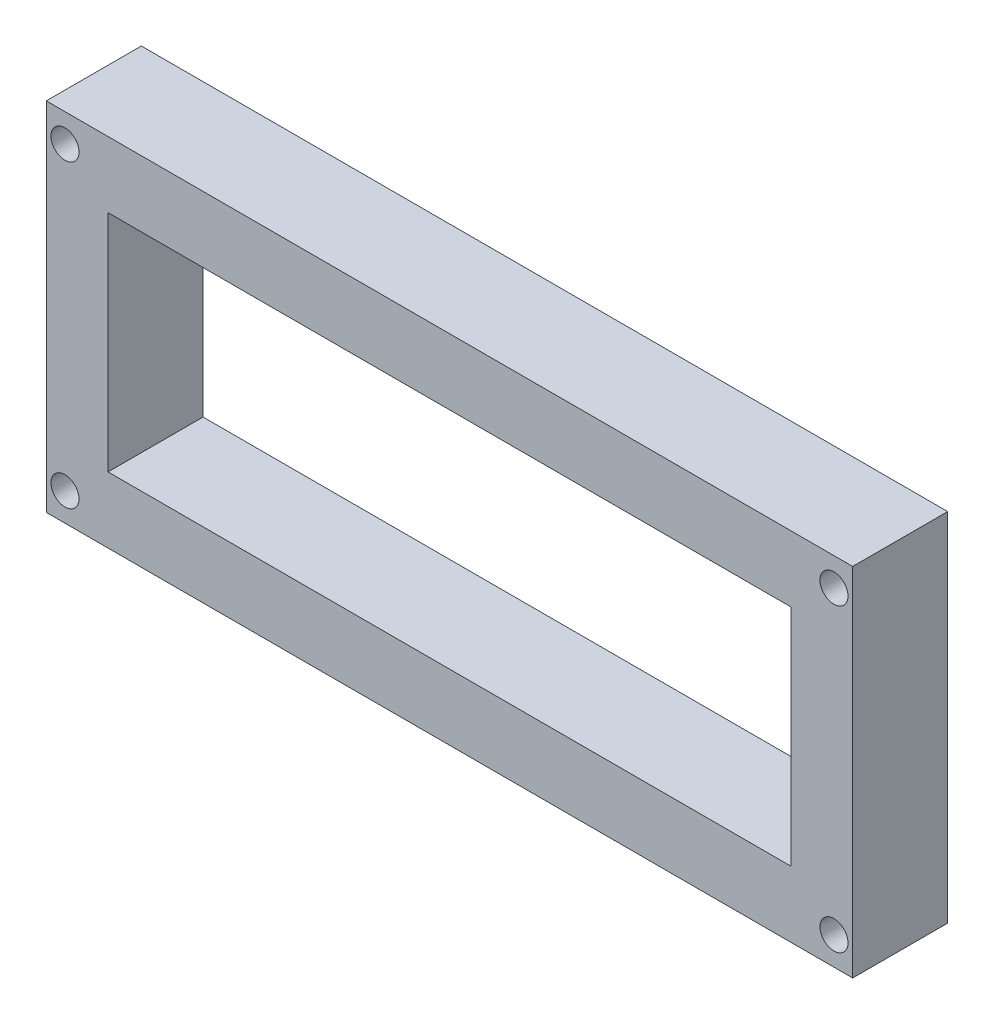
ISO-10303-21;
HEADER;
FILE_DESCRIPTION(('STEP AP214'),'2;1');
FILE_NAME('part.step','',(''),(''),'','','');
FILE_SCHEMA(('AUTOMOTIVE_DESIGN { 1 0 10303 214 1 1 1 1 }'));
ENDSEC;
DATA;
#1=APPLICATION_CONTEXT('core data for automotive mechanical design processes');
#2=APPLICATION_PROTOCOL_DEFINITION('international standard','automotive_design',2000,#1);
#3=PRODUCT_CONTEXT('',#1,'mechanical');
#4=PRODUCT('Part','Part','',(#3));
#5=PRODUCT_RELATED_PRODUCT_CATEGORY('part','',(#4));
#6=PRODUCT_DEFINITION_FORMATION('','',#4);
#7=PRODUCT_DEFINITION_CONTEXT('part definition',#1,'design');
#8=PRODUCT_DEFINITION('design','',#6,#7);
#9=PRODUCT_DEFINITION_SHAPE('','',#8);
#10=(LENGTH_UNIT() NAMED_UNIT(*) SI_UNIT(.MILLI.,.METRE.));
#11=(NAMED_UNIT(*) PLANE_ANGLE_UNIT() SI_UNIT($,.RADIAN.));
#12=(NAMED_UNIT(*) SI_UNIT($,.STERADIAN.) SOLID_ANGLE_UNIT());
#13=UNCERTAINTY_MEASURE_WITH_UNIT(LENGTH_MEASURE(1.E-05),#10,'distance_accuracy_value','');
#14=(GEOMETRIC_REPRESENTATION_CONTEXT(3) GLOBAL_UNCERTAINTY_ASSIGNED_CONTEXT((#13)) GLOBAL_UNIT_ASSIGNED_CONTEXT((#10,
#11,#12)) REPRESENTATION_CONTEXT('',''));
#15=CARTESIAN_POINT('',(0.,0.,0.));
#16=DIRECTION('',(0.,0.,1.));
#17=DIRECTION('',(1.,0.,0.));
#18=AXIS2_PLACEMENT_3D('',#15,#16,#17);
#19=CARTESIAN_POINT('',(0.,0.,10.16));
#20=DIRECTION('',(0.,0.,1.));
#21=DIRECTION('',(1.,0.,0.));
#22=AXIS2_PLACEMENT_3D('',#19,#20,#21);
#23=PLANE('',#22);
#24=CARTESIAN_POINT('',(41.099999963,-16.05,10.16));
#25=DIRECTION('',(0.,0.,1.));
#26=DIRECTION('',(-1.,0.,0.));
#27=AXIS2_PLACEMENT_3D('',#24,#25,#26);
#28=CIRCLE('',#27,1.5);
#29=CARTESIAN_POINT('',(39.599999963,-16.05,10.16));
#30=VERTEX_POINT('',#29);
#31=EDGE_CURVE('E258',#30,#30,#28,.T.);
#32=ORIENTED_EDGE('',*,*,#31,.F.);
#33=EDGE_LOOP('',(#32));
#34=FACE_BOUND('',#33,.T.);
#35=CARTESIAN_POINT('',(-41.099999963,-16.05,10.16));
#36=DIRECTION('',(0.,0.,1.));
#37=DIRECTION('',(1.,0.,0.));
#38=AXIS2_PLACEMENT_3D('',#35,#36,#37);
#39=CIRCLE('',#38,1.5);
#40=CARTESIAN_POINT('',(-39.599999963,-16.05,10.16));
#41=VERTEX_POINT('',#40);
#42=EDGE_CURVE('E250',#41,#41,#39,.T.);
#43=ORIENTED_EDGE('',*,*,#42,.F.);
#44=EDGE_LOOP('',(#43));
#45=FACE_BOUND('',#44,.T.);
#46=CARTESIAN_POINT('',(-41.099999963,16.05,10.16));
#47=DIRECTION('',(0.,0.,1.));
#48=DIRECTION('',(-1.,0.,0.));
#49=AXIS2_PLACEMENT_3D('',#46,#47,#48);
#50=CIRCLE('',#49,1.5);
#51=CARTESIAN_POINT('',(-42.599999963,16.05,10.16));
#52=VERTEX_POINT('',#51);
#53=EDGE_CURVE('E245',#52,#52,#50,.T.);
#54=ORIENTED_EDGE('',*,*,#53,.F.);
#55=EDGE_LOOP('',(#54));
#56=FACE_BOUND('',#55,.T.);
#57=CARTESIAN_POINT('',(41.099999963,16.05,10.16));
#58=DIRECTION('',(0.,0.,1.));
#59=DIRECTION('',(1.,0.,0.));
#60=AXIS2_PLACEMENT_3D('',#57,#58,#59);
#61=CIRCLE('',#60,1.5);
#62=CARTESIAN_POINT('',(42.599999963,16.05,10.16));
#63=VERTEX_POINT('',#62);
#64=EDGE_CURVE('E247',#63,#63,#61,.T.);
#65=ORIENTED_EDGE('',*,*,#64,.F.);
#66=EDGE_LOOP('',(#65));
#67=FACE_BOUND('',#66,.T.);
#68=DIRECTION('',(0.,-1.,0.));
#69=VECTOR('',#68,1.);
#70=CARTESIAN_POINT('',(-43.099999963,19.05,10.16));
#71=LINE('',#70,#69);
#72=CARTESIAN_POINT('',(-43.099999963,19.05,10.16));
#73=VERTEX_POINT('',#72);
#74=CARTESIAN_POINT('',(-43.099999963,-19.05,10.16));
#75=VERTEX_POINT('',#74);
#76=EDGE_CURVE('E142',#73,#75,#71,.T.);
#77=ORIENTED_EDGE('',*,*,#76,.T.);
#78=DIRECTION('',(1.,0.,0.));
#79=VECTOR('',#78,1.);
#80=CARTESIAN_POINT('',(-43.099999963,-19.05,10.16));
#81=LINE('',#80,#79);
#82=CARTESIAN_POINT('',(43.099999963,-19.05,10.16));
#83=VERTEX_POINT('',#82);
#84=EDGE_CURVE('E145',#75,#83,#81,.T.);
#85=ORIENTED_EDGE('',*,*,#84,.T.);
#86=DIRECTION('',(0.,1.,0.));
#87=VECTOR('',#86,1.);
#88=CARTESIAN_POINT('',(43.099999963,19.05,10.16));
#89=LINE('',#88,#87);
#90=CARTESIAN_POINT('',(43.099999963,19.05,10.16));
#91=VERTEX_POINT('',#90);
#92=EDGE_CURVE('E148',#83,#91,#89,.T.);
#93=ORIENTED_EDGE('',*,*,#92,.T.);
#94=DIRECTION('',(-1.,0.,0.));
#95=VECTOR('',#94,1.);
#96=CARTESIAN_POINT('',(-43.099999963,19.05,10.16));
#97=LINE('',#96,#95);
#98=EDGE_CURVE('E150',#91,#73,#97,.T.);
#99=ORIENTED_EDGE('',*,*,#98,.T.);
#100=EDGE_LOOP('',(#77,#85,#93,#99));
#101=FACE_BOUND('',#100,.T.);
#102=DIRECTION('',(1.,0.,0.));
#103=VECTOR('',#102,1.);
#104=CARTESIAN_POINT('',(-36.5,-12.,10.16));
#105=LINE('',#104,#103);
#106=CARTESIAN_POINT('',(-36.5,-12.,10.16));
#107=VERTEX_POINT('',#106);
#108=CARTESIAN_POINT('',(36.5,-12.,10.16));
#109=VERTEX_POINT('',#108);
#110=EDGE_CURVE('E112',#107,#109,#105,.T.);
#111=ORIENTED_EDGE('',*,*,#110,.F.);
#112=DIRECTION('',(0.,-1.,0.));
#113=VECTOR('',#112,1.);
#114=CARTESIAN_POINT('',(-36.5,12.,10.16));
#115=LINE('',#114,#113);
#116=CARTESIAN_POINT('',(-36.5,12.,10.16));
#117=VERTEX_POINT('',#116);
#118=EDGE_CURVE('E104',#117,#107,#115,.T.);
#119=ORIENTED_EDGE('',*,*,#118,.F.);
#120=DIRECTION('',(-1.,0.,0.));
#121=VECTOR('',#120,1.);
#122=CARTESIAN_POINT('',(-36.5,12.,10.16));
#123=LINE('',#122,#121);
#124=CARTESIAN_POINT('',(36.5,12.,10.16));
#125=VERTEX_POINT('',#124);
#126=EDGE_CURVE('E126',#125,#117,#123,.T.);
#127=ORIENTED_EDGE('',*,*,#126,.F.);
#128=DIRECTION('',(0.,1.,0.));
#129=VECTOR('',#128,1.);
#130=CARTESIAN_POINT('',(36.5,12.,10.16));
#131=LINE('',#130,#129);
#132=EDGE_CURVE('E124',#109,#125,#131,.T.);
#133=ORIENTED_EDGE('',*,*,#132,.F.);
#134=EDGE_LOOP('',(#111,#119,#127,#133));
#135=FACE_BOUND('',#134,.T.);
#136=ADVANCED_FACE('F39',(#34,#45,#56,#67,#101,#135),#23,.T.);
#137=CARTESIAN_POINT('',(0.,0.,0.));
#138=DIRECTION('',(0.,0.,1.));
#139=DIRECTION('',(1.,0.,0.));
#140=AXIS2_PLACEMENT_3D('',#137,#138,#139);
#141=PLANE('',#140);
#142=CARTESIAN_POINT('',(41.099999963,-16.05,0.));
#143=DIRECTION('',(0.,0.,1.));
#144=DIRECTION('',(-1.,0.,0.));
#145=AXIS2_PLACEMENT_3D('',#142,#143,#144);
#146=CIRCLE('',#145,1.5);
#147=CARTESIAN_POINT('',(39.599999963,-16.05,0.));
#148=VERTEX_POINT('',#147);
#149=EDGE_CURVE('E261',#148,#148,#146,.T.);
#150=ORIENTED_EDGE('',*,*,#149,.T.);
#151=EDGE_LOOP('',(#150));
#152=FACE_BOUND('',#151,.T.);
#153=CARTESIAN_POINT('',(-41.099999963,-16.05,0.));
#154=DIRECTION('',(0.,0.,1.));
#155=DIRECTION('',(1.,0.,0.));
#156=AXIS2_PLACEMENT_3D('',#153,#154,#155);
#157=CIRCLE('',#156,1.5);
#158=CARTESIAN_POINT('',(-39.599999963,-16.05,0.));
#159=VERTEX_POINT('',#158);
#160=EDGE_CURVE('E255',#159,#159,#157,.T.);
#161=ORIENTED_EDGE('',*,*,#160,.T.);
#162=EDGE_LOOP('',(#161));
#163=FACE_BOUND('',#162,.T.);
#164=CARTESIAN_POINT('',(-41.099999963,16.05,0.));
#165=DIRECTION('',(0.,0.,1.));
#166=DIRECTION('',(-1.,0.,0.));
#167=AXIS2_PLACEMENT_3D('',#164,#165,#166);
#168=CIRCLE('',#167,1.5);
#169=CARTESIAN_POINT('',(-42.599999963,16.05,0.));
#170=VERTEX_POINT('',#169);
#171=EDGE_CURVE('E242',#170,#170,#168,.T.);
#172=ORIENTED_EDGE('',*,*,#171,.T.);
#173=EDGE_LOOP('',(#172));
#174=FACE_BOUND('',#173,.T.);
#175=CARTESIAN_POINT('',(41.099999963,16.05,0.));
#176=DIRECTION('',(0.,0.,1.));
#177=DIRECTION('',(1.,0.,0.));
#178=AXIS2_PLACEMENT_3D('',#175,#176,#177);
#179=CIRCLE('',#178,1.5);
#180=CARTESIAN_POINT('',(42.599999963,16.05,0.));
#181=VERTEX_POINT('',#180);
#182=EDGE_CURVE('E132',#181,#181,#179,.T.);
#183=ORIENTED_EDGE('',*,*,#182,.T.);
#184=EDGE_LOOP('',(#183));
#185=FACE_BOUND('',#184,.T.);
#186=DIRECTION('',(0.,-1.,0.));
#187=VECTOR('',#186,1.);
#188=CARTESIAN_POINT('',(-43.099999963,19.05,0.));
#189=LINE('',#188,#187);
#190=CARTESIAN_POINT('',(-43.099999963,19.05,0.));
#191=VERTEX_POINT('',#190);
#192=CARTESIAN_POINT('',(-43.099999963,-19.05,0.));
#193=VERTEX_POINT('',#192);
#194=EDGE_CURVE('E120',#191,#193,#189,.T.);
#195=ORIENTED_EDGE('',*,*,#194,.F.);
#196=DIRECTION('',(-1.,0.,0.));
#197=VECTOR('',#196,1.);
#198=CARTESIAN_POINT('',(-43.099999963,19.05,0.));
#199=LINE('',#198,#197);
#200=CARTESIAN_POINT('',(43.099999963,19.05,0.));
#201=VERTEX_POINT('',#200);
#202=EDGE_CURVE('E146',#201,#191,#199,.T.);
#203=ORIENTED_EDGE('',*,*,#202,.F.);
#204=DIRECTION('',(0.,1.,0.));
#205=VECTOR('',#204,1.);
#206=CARTESIAN_POINT('',(43.099999963,19.05,0.));
#207=LINE('',#206,#205);
#208=CARTESIAN_POINT('',(43.099999963,-19.05,0.));
#209=VERTEX_POINT('',#208);
#210=EDGE_CURVE('E157',#209,#201,#207,.T.);
#211=ORIENTED_EDGE('',*,*,#210,.F.);
#212=DIRECTION('',(1.,0.,0.));
#213=VECTOR('',#212,1.);
#214=CARTESIAN_POINT('',(-43.099999963,-19.05,0.));
#215=LINE('',#214,#213);
#216=EDGE_CURVE('E155',#193,#209,#215,.T.);
#217=ORIENTED_EDGE('',*,*,#216,.F.);
#218=EDGE_LOOP('',(#195,#203,#211,#217));
#219=FACE_BOUND('',#218,.T.);
#220=DIRECTION('',(0.,-1.,0.));
#221=VECTOR('',#220,1.);
#222=CARTESIAN_POINT('',(-36.5,12.,0.));
#223=LINE('',#222,#221);
#224=CARTESIAN_POINT('',(-36.5,12.,0.));
#225=VERTEX_POINT('',#224);
#226=CARTESIAN_POINT('',(-36.5,-12.,0.));
#227=VERTEX_POINT('',#226);
#228=EDGE_CURVE('E62',#225,#227,#223,.T.);
#229=ORIENTED_EDGE('',*,*,#228,.T.);
#230=DIRECTION('',(1.,0.,0.));
#231=VECTOR('',#230,1.);
#232=CARTESIAN_POINT('',(-36.5,-12.,0.));
#233=LINE('',#232,#231);
#234=CARTESIAN_POINT('',(36.5,-12.,0.));
#235=VERTEX_POINT('',#234);
#236=EDGE_CURVE('E119',#227,#235,#233,.T.);
#237=ORIENTED_EDGE('',*,*,#236,.T.);
#238=DIRECTION('',(0.,1.,0.));
#239=VECTOR('',#238,1.);
#240=CARTESIAN_POINT('',(36.5,12.,0.));
#241=LINE('',#240,#239);
#242=CARTESIAN_POINT('',(36.5,12.,0.));
#243=VERTEX_POINT('',#242);
#244=EDGE_CURVE('E134',#235,#243,#241,.T.);
#245=ORIENTED_EDGE('',*,*,#244,.T.);
#246=DIRECTION('',(-1.,0.,0.));
#247=VECTOR('',#246,1.);
#248=CARTESIAN_POINT('',(-36.5,12.,0.));
#249=LINE('',#248,#247);
#250=EDGE_CURVE('E113',#243,#225,#249,.T.);
#251=ORIENTED_EDGE('',*,*,#250,.T.);
#252=EDGE_LOOP('',(#229,#237,#245,#251));
#253=FACE_BOUND('',#252,.T.);
#254=ADVANCED_FACE('F175',(#152,#163,#174,#185,#219,#253),#141,.F.);
#255=CARTESIAN_POINT('',(-43.099999963,19.05,10.16));
#256=DIRECTION('',(1.,0.,0.));
#257=DIRECTION('',(0.,0.,-1.));
#258=AXIS2_PLACEMENT_3D('',#255,#256,#257);
#259=PLANE('',#258);
#260=ORIENTED_EDGE('',*,*,#194,.T.);
#261=DIRECTION('',(0.,0.,-1.));
#262=VECTOR('',#261,1.);
#263=CARTESIAN_POINT('',(-43.099999963,-19.05,10.16));
#264=LINE('',#263,#262);
#265=EDGE_CURVE('E11',#75,#193,#264,.T.);
#266=ORIENTED_EDGE('',*,*,#265,.F.);
#267=ORIENTED_EDGE('',*,*,#76,.F.);
#268=DIRECTION('',(0.,0.,-1.));
#269=VECTOR('',#268,1.);
#270=CARTESIAN_POINT('',(-43.099999963,19.05,10.16));
#271=LINE('',#270,#269);
#272=EDGE_CURVE('E152',#73,#191,#271,.T.);
#273=ORIENTED_EDGE('',*,*,#272,.T.);
#274=EDGE_LOOP('',(#260,#266,#267,#273));
#275=FACE_BOUND('',#274,.T.);
#276=ADVANCED_FACE('F41',(#275),#259,.F.);
#277=CARTESIAN_POINT('',(-43.099999963,-19.05,10.16));
#278=DIRECTION('',(0.,1.,0.));
#279=DIRECTION('',(0.,0.,1.));
#280=AXIS2_PLACEMENT_3D('',#277,#278,#279);
#281=PLANE('',#280);
#282=ORIENTED_EDGE('',*,*,#216,.T.);
#283=DIRECTION('',(0.,0.,-1.));
#284=VECTOR('',#283,1.);
#285=CARTESIAN_POINT('',(43.099999963,-19.05,10.16));
#286=LINE('',#285,#284);
#287=EDGE_CURVE('E47',#83,#209,#286,.T.);
#288=ORIENTED_EDGE('',*,*,#287,.F.);
#289=ORIENTED_EDGE('',*,*,#84,.F.);
#290=ORIENTED_EDGE('',*,*,#265,.T.);
#291=EDGE_LOOP('',(#282,#288,#289,#290));
#292=FACE_BOUND('',#291,.T.);
#293=ADVANCED_FACE('F185',(#292),#281,.F.);
#294=CARTESIAN_POINT('',(43.099999963,19.05,10.16));
#295=DIRECTION('',(-1.,0.,0.));
#296=DIRECTION('',(0.,0.,1.));
#297=AXIS2_PLACEMENT_3D('',#294,#295,#296);
#298=PLANE('',#297);
#299=ORIENTED_EDGE('',*,*,#210,.T.);
#300=DIRECTION('',(0.,0.,-1.));
#301=VECTOR('',#300,1.);
#302=CARTESIAN_POINT('',(43.099999963,19.05,10.16));
#303=LINE('',#302,#301);
#304=EDGE_CURVE('E162',#91,#201,#303,.T.);
#305=ORIENTED_EDGE('',*,*,#304,.F.);
#306=ORIENTED_EDGE('',*,*,#92,.F.);
#307=ORIENTED_EDGE('',*,*,#287,.T.);
#308=EDGE_LOOP('',(#299,#305,#306,#307));
#309=FACE_BOUND('',#308,.T.);
#310=ADVANCED_FACE('F169',(#309),#298,.F.);
#311=CARTESIAN_POINT('',(-43.099999963,19.05,10.16));
#312=DIRECTION('',(0.,-1.,0.));
#313=DIRECTION('',(0.,0.,-1.));
#314=AXIS2_PLACEMENT_3D('',#311,#312,#313);
#315=PLANE('',#314);
#316=ORIENTED_EDGE('',*,*,#202,.T.);
#317=ORIENTED_EDGE('',*,*,#272,.F.);
#318=ORIENTED_EDGE('',*,*,#98,.F.);
#319=ORIENTED_EDGE('',*,*,#304,.T.);
#320=EDGE_LOOP('',(#316,#317,#318,#319));
#321=FACE_BOUND('',#320,.T.);
#322=ADVANCED_FACE('F179',(#321),#315,.F.);
#323=CARTESIAN_POINT('',(-36.5,12.,10.16));
#324=DIRECTION('',(1.,0.,0.));
#325=DIRECTION('',(0.,0.,-1.));
#326=AXIS2_PLACEMENT_3D('',#323,#324,#325);
#327=PLANE('',#326);
#328=ORIENTED_EDGE('',*,*,#228,.F.);
#329=DIRECTION('',(0.,0.,-1.));
#330=VECTOR('',#329,1.);
#331=CARTESIAN_POINT('',(-36.5,12.,10.16));
#332=LINE('',#331,#330);
#333=EDGE_CURVE('E108',#117,#225,#332,.T.);
#334=ORIENTED_EDGE('',*,*,#333,.F.);
#335=ORIENTED_EDGE('',*,*,#118,.T.);
#336=DIRECTION('',(0.,0.,-1.));
#337=VECTOR('',#336,1.);
#338=CARTESIAN_POINT('',(-36.5,-12.,10.16));
#339=LINE('',#338,#337);
#340=EDGE_CURVE('E107',#107,#227,#339,.T.);
#341=ORIENTED_EDGE('',*,*,#340,.T.);
#342=EDGE_LOOP('',(#328,#334,#335,#341));
#343=FACE_BOUND('',#342,.T.);
#344=ADVANCED_FACE('F106',(#343),#327,.T.);
#345=CARTESIAN_POINT('',(-36.5,-12.,10.16));
#346=DIRECTION('',(0.,1.,0.));
#347=DIRECTION('',(0.,0.,1.));
#348=AXIS2_PLACEMENT_3D('',#345,#346,#347);
#349=PLANE('',#348);
#350=ORIENTED_EDGE('',*,*,#236,.F.);
#351=ORIENTED_EDGE('',*,*,#340,.F.);
#352=ORIENTED_EDGE('',*,*,#110,.T.);
#353=DIRECTION('',(0.,0.,-1.));
#354=VECTOR('',#353,1.);
#355=CARTESIAN_POINT('',(36.5,-12.,10.16));
#356=LINE('',#355,#354);
#357=EDGE_CURVE('E121',#109,#235,#356,.T.);
#358=ORIENTED_EDGE('',*,*,#357,.T.);
#359=EDGE_LOOP('',(#350,#351,#352,#358));
#360=FACE_BOUND('',#359,.T.);
#361=ADVANCED_FACE('F116',(#360),#349,.T.);
#362=CARTESIAN_POINT('',(36.5,12.,10.16));
#363=DIRECTION('',(-1.,0.,0.));
#364=DIRECTION('',(0.,0.,1.));
#365=AXIS2_PLACEMENT_3D('',#362,#363,#364);
#366=PLANE('',#365);
#367=ORIENTED_EDGE('',*,*,#244,.F.);
#368=ORIENTED_EDGE('',*,*,#357,.F.);
#369=ORIENTED_EDGE('',*,*,#132,.T.);
#370=DIRECTION('',(0.,0.,-1.));
#371=VECTOR('',#370,1.);
#372=CARTESIAN_POINT('',(36.5,12.,10.16));
#373=LINE('',#372,#371);
#374=EDGE_CURVE('E54',#125,#243,#373,.T.);
#375=ORIENTED_EDGE('',*,*,#374,.T.);
#376=EDGE_LOOP('',(#367,#368,#369,#375));
#377=FACE_BOUND('',#376,.T.);
#378=ADVANCED_FACE('F213',(#377),#366,.T.);
#379=CARTESIAN_POINT('',(-36.5,12.,10.16));
#380=DIRECTION('',(0.,-1.,0.));
#381=DIRECTION('',(0.,0.,-1.));
#382=AXIS2_PLACEMENT_3D('',#379,#380,#381);
#383=PLANE('',#382);
#384=ORIENTED_EDGE('',*,*,#250,.F.);
#385=ORIENTED_EDGE('',*,*,#374,.F.);
#386=ORIENTED_EDGE('',*,*,#126,.T.);
#387=ORIENTED_EDGE('',*,*,#333,.T.);
#388=EDGE_LOOP('',(#384,#385,#386,#387));
#389=FACE_BOUND('',#388,.T.);
#390=ADVANCED_FACE('F217',(#389),#383,.T.);
#391=CARTESIAN_POINT('',(41.099999963,16.05,0.));
#392=DIRECTION('',(0.,0.,1.));
#393=DIRECTION('',(1.,0.,0.));
#394=AXIS2_PLACEMENT_3D('',#391,#392,#393);
#395=CYLINDRICAL_SURFACE('',#394,1.5);
#396=ORIENTED_EDGE('',*,*,#182,.F.);
#397=EDGE_LOOP('',(#396));
#398=FACE_BOUND('',#397,.T.);
#399=ORIENTED_EDGE('',*,*,#64,.T.);
#400=EDGE_LOOP('',(#399));
#401=FACE_BOUND('',#400,.T.);
#402=ADVANCED_FACE('F222',(#398,#401),#395,.F.);
#403=CARTESIAN_POINT('',(-41.099999963,16.05,0.));
#404=DIRECTION('',(0.,0.,1.));
#405=DIRECTION('',(1.,0.,0.));
#406=AXIS2_PLACEMENT_3D('',#403,#404,#405);
#407=CYLINDRICAL_SURFACE('',#406,1.5);
#408=ORIENTED_EDGE('',*,*,#171,.F.);
#409=EDGE_LOOP('',(#408));
#410=FACE_BOUND('',#409,.T.);
#411=ORIENTED_EDGE('',*,*,#53,.T.);
#412=EDGE_LOOP('',(#411));
#413=FACE_BOUND('',#412,.T.);
#414=ADVANCED_FACE('F225',(#410,#413),#407,.F.);
#415=CARTESIAN_POINT('',(-41.099999963,-16.05,0.));
#416=DIRECTION('',(0.,0.,1.));
#417=DIRECTION('',(1.,0.,0.));
#418=AXIS2_PLACEMENT_3D('',#415,#416,#417);
#419=CYLINDRICAL_SURFACE('',#418,1.5);
#420=ORIENTED_EDGE('',*,*,#160,.F.);
#421=EDGE_LOOP('',(#420));
#422=FACE_BOUND('',#421,.T.);
#423=ORIENTED_EDGE('',*,*,#42,.T.);
#424=EDGE_LOOP('',(#423));
#425=FACE_BOUND('',#424,.T.);
#426=ADVANCED_FACE('F230',(#422,#425),#419,.F.);
#427=CARTESIAN_POINT('',(41.099999963,-16.05,0.));
#428=DIRECTION('',(0.,0.,1.));
#429=DIRECTION('',(1.,0.,0.));
#430=AXIS2_PLACEMENT_3D('',#427,#428,#429);
#431=CYLINDRICAL_SURFACE('',#430,1.5);
#432=ORIENTED_EDGE('',*,*,#149,.F.);
#433=EDGE_LOOP('',(#432));
#434=FACE_BOUND('',#433,.T.);
#435=ORIENTED_EDGE('',*,*,#31,.T.);
#436=EDGE_LOOP('',(#435));
#437=FACE_BOUND('',#436,.T.);
#438=ADVANCED_FACE('F227',(#434,#437),#431,.F.);
#439=CLOSED_SHELL('',(#136,#254,#276,#293,#310,#322,#344,#361,#378,#390,#402,#414,#426,#438));
#440=MANIFOLD_SOLID_BREP('B2',#439);
#441=ADVANCED_BREP_SHAPE_REPRESENTATION('',(#18,#440),#14);
#442=SHAPE_DEFINITION_REPRESENTATION(#9,#441);
ENDSEC;
END-ISO-10303-21;
